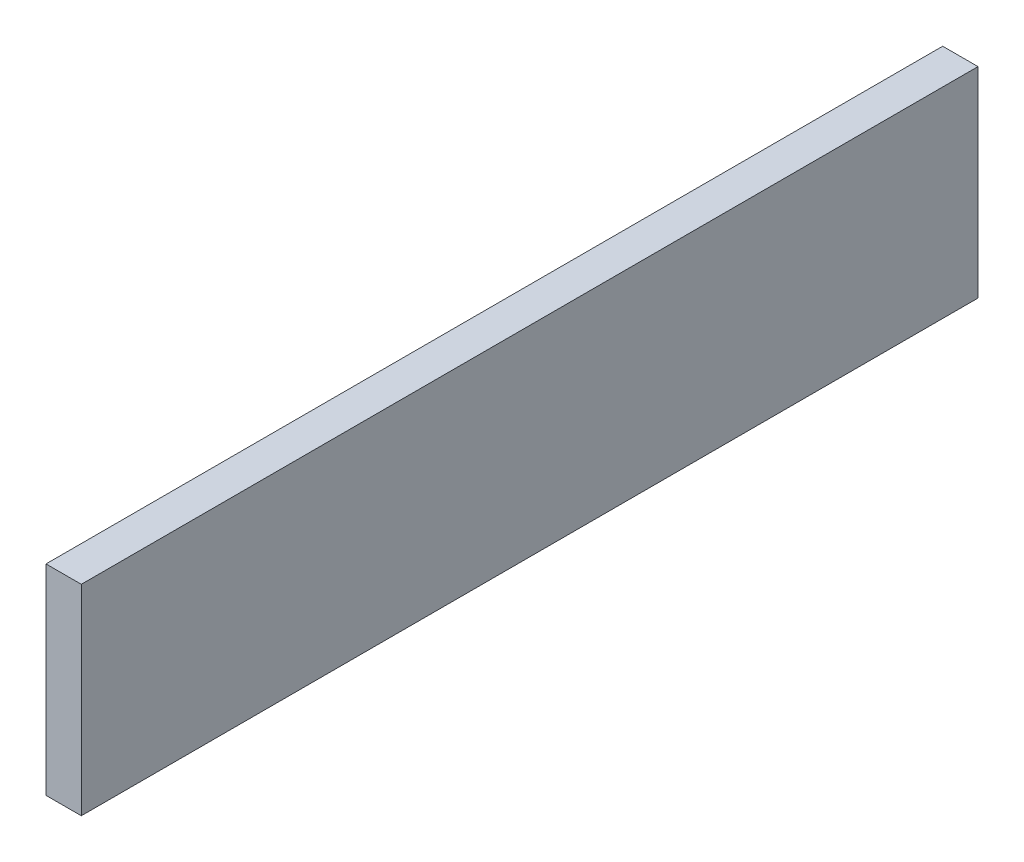
ISO-10303-21;
HEADER;
FILE_DESCRIPTION(('STEP AP214'),'2;1');
FILE_NAME('part.step','',(''),(''),'','','');
FILE_SCHEMA(('AUTOMOTIVE_DESIGN { 1 0 10303 214 1 1 1 1 }'));
ENDSEC;
DATA;
#1=APPLICATION_CONTEXT('core data for automotive mechanical design processes');
#2=APPLICATION_PROTOCOL_DEFINITION('international standard','automotive_design',2000,#1);
#3=PRODUCT_CONTEXT('',#1,'mechanical');
#4=PRODUCT('Part','Part','',(#3));
#5=PRODUCT_RELATED_PRODUCT_CATEGORY('part','',(#4));
#6=PRODUCT_DEFINITION_FORMATION('','',#4);
#7=PRODUCT_DEFINITION_CONTEXT('part definition',#1,'design');
#8=PRODUCT_DEFINITION('design','',#6,#7);
#9=PRODUCT_DEFINITION_SHAPE('','',#8);
#10=(LENGTH_UNIT() NAMED_UNIT(*) SI_UNIT(.MILLI.,.METRE.));
#11=(NAMED_UNIT(*) PLANE_ANGLE_UNIT() SI_UNIT($,.RADIAN.));
#12=(NAMED_UNIT(*) SI_UNIT($,.STERADIAN.) SOLID_ANGLE_UNIT());
#13=UNCERTAINTY_MEASURE_WITH_UNIT(LENGTH_MEASURE(1.E-05),#10,'distance_accuracy_value','');
#14=(GEOMETRIC_REPRESENTATION_CONTEXT(3) GLOBAL_UNCERTAINTY_ASSIGNED_CONTEXT((#13)) GLOBAL_UNIT_ASSIGNED_CONTEXT((#10,
#11,#12)) REPRESENTATION_CONTEXT('',''));
#15=CARTESIAN_POINT('',(0.,0.,0.));
#16=DIRECTION('',(0.,0.,1.));
#17=DIRECTION('',(1.,0.,0.));
#18=AXIS2_PLACEMENT_3D('',#15,#16,#17);
#19=CARTESIAN_POINT('',(57.8859814028704,-22.9233020012127,254.));
#20=DIRECTION('',(0.,0.,1.));
#21=DIRECTION('',(0.,1.,0.));
#22=AXIS2_PLACEMENT_3D('',#19,#20,#21);
#23=PLANE('',#22);
#24=DIRECTION('',(1.,0.,0.));
#25=VECTOR('',#24,1.);
#26=CARTESIAN_POINT('',(57.8859814028704,33.8661128330678,254.));
#27=LINE('',#26,#25);
#28=CARTESIAN_POINT('',(47.8859814028704,33.8661128330678,254.));
#29=VERTEX_POINT('',#28);
#30=CARTESIAN_POINT('',(57.8859814028704,33.8661128330678,254.));
#31=VERTEX_POINT('',#30);
#32=EDGE_CURVE('E11',#29,#31,#27,.T.);
#33=ORIENTED_EDGE('',*,*,#32,.F.);
#34=DIRECTION('',(0.,1.,0.));
#35=VECTOR('',#34,1.);
#36=CARTESIAN_POINT('',(47.8859814028704,-22.9233020012127,254.));
#37=LINE('',#36,#35);
#38=CARTESIAN_POINT('',(47.8859814028704,-22.9233020012127,254.));
#39=VERTEX_POINT('',#38);
#40=EDGE_CURVE('E101',#39,#29,#37,.T.);
#41=ORIENTED_EDGE('',*,*,#40,.F.);
#42=DIRECTION('',(1.,0.,0.));
#43=VECTOR('',#42,1.);
#44=CARTESIAN_POINT('',(57.8859814028704,-22.9233020012127,254.));
#45=LINE('',#44,#43);
#46=CARTESIAN_POINT('',(57.8859814028704,-22.9233020012127,254.));
#47=VERTEX_POINT('',#46);
#48=EDGE_CURVE('E57',#39,#47,#45,.T.);
#49=ORIENTED_EDGE('',*,*,#48,.T.);
#50=DIRECTION('',(0.,1.,0.));
#51=VECTOR('',#50,1.);
#52=CARTESIAN_POINT('',(57.8859814028704,-22.9233020012127,254.));
#53=LINE('',#52,#51);
#54=EDGE_CURVE('E114',#47,#31,#53,.T.);
#55=ORIENTED_EDGE('',*,*,#54,.T.);
#56=EDGE_LOOP('',(#33,#41,#49,#55));
#57=FACE_BOUND('',#56,.T.);
#58=ADVANCED_FACE('F47',(#57),#23,.T.);
#59=CARTESIAN_POINT('',(57.8859814028704,-22.9233020012127,254.));
#60=DIRECTION('',(0.,1.,0.));
#61=DIRECTION('',(0.,0.,-1.));
#62=AXIS2_PLACEMENT_3D('',#59,#60,#61);
#63=PLANE('',#62);
#64=ORIENTED_EDGE('',*,*,#48,.F.);
#65=DIRECTION('',(0.,0.,1.));
#66=VECTOR('',#65,1.);
#67=CARTESIAN_POINT('',(47.8859814028704,-22.9233020012127,254.));
#68=LINE('',#67,#66);
#69=CARTESIAN_POINT('',(47.8859814028704,-22.9233020012127,0.));
#70=VERTEX_POINT('',#69);
#71=EDGE_CURVE('E108',#39,#70,#68,.F.);
#72=ORIENTED_EDGE('',*,*,#71,.T.);
#73=DIRECTION('',(1.,0.,0.));
#74=VECTOR('',#73,1.);
#75=CARTESIAN_POINT('',(57.8859814028704,-22.9233020012127,0.));
#76=LINE('',#75,#74);
#77=CARTESIAN_POINT('',(57.8859814028704,-22.9233020012127,0.));
#78=VERTEX_POINT('',#77);
#79=EDGE_CURVE('E65',#70,#78,#76,.T.);
#80=ORIENTED_EDGE('',*,*,#79,.T.);
#81=DIRECTION('',(0.,0.,-1.));
#82=VECTOR('',#81,1.);
#83=CARTESIAN_POINT('',(57.8859814028704,-22.9233020012127,254.));
#84=LINE('',#83,#82);
#85=EDGE_CURVE('E95',#47,#78,#84,.T.);
#86=ORIENTED_EDGE('',*,*,#85,.F.);
#87=EDGE_LOOP('',(#64,#72,#80,#86));
#88=FACE_BOUND('',#87,.T.);
#89=ADVANCED_FACE('F118',(#88),#63,.F.);
#90=CARTESIAN_POINT('',(57.8859814028704,-22.9233020012127,0.));
#91=DIRECTION('',(0.,0.,1.));
#92=DIRECTION('',(0.,1.,0.));
#93=AXIS2_PLACEMENT_3D('',#90,#91,#92);
#94=PLANE('',#93);
#95=ORIENTED_EDGE('',*,*,#79,.F.);
#96=DIRECTION('',(0.,1.,0.));
#97=VECTOR('',#96,1.);
#98=CARTESIAN_POINT('',(47.8859814028704,-22.9233020012127,0.));
#99=LINE('',#98,#97);
#100=CARTESIAN_POINT('',(47.8859814028704,33.8661128330678,0.));
#101=VERTEX_POINT('',#100);
#102=EDGE_CURVE('E100',#70,#101,#99,.T.);
#103=ORIENTED_EDGE('',*,*,#102,.T.);
#104=DIRECTION('',(1.,0.,0.));
#105=VECTOR('',#104,1.);
#106=CARTESIAN_POINT('',(57.8859814028704,33.8661128330678,0.));
#107=LINE('',#106,#105);
#108=CARTESIAN_POINT('',(57.8859814028704,33.8661128330678,0.));
#109=VERTEX_POINT('',#108);
#110=EDGE_CURVE('E51',#101,#109,#107,.T.);
#111=ORIENTED_EDGE('',*,*,#110,.T.);
#112=DIRECTION('',(0.,1.,0.));
#113=VECTOR('',#112,1.);
#114=CARTESIAN_POINT('',(57.8859814028704,-22.9233020012127,0.));
#115=LINE('',#114,#113);
#116=EDGE_CURVE('E110',#78,#109,#115,.T.);
#117=ORIENTED_EDGE('',*,*,#116,.F.);
#118=EDGE_LOOP('',(#95,#103,#111,#117));
#119=FACE_BOUND('',#118,.T.);
#120=ADVANCED_FACE('F103',(#119),#94,.F.);
#121=CARTESIAN_POINT('',(57.8859814028704,33.8661128330678,254.));
#122=DIRECTION('',(0.,1.,0.));
#123=DIRECTION('',(0.,0.,-1.));
#124=AXIS2_PLACEMENT_3D('',#121,#122,#123);
#125=PLANE('',#124);
#126=DIRECTION('',(0.,0.,1.));
#127=VECTOR('',#126,1.);
#128=CARTESIAN_POINT('',(47.8859814028704,33.8661128330678,254.));
#129=LINE('',#128,#127);
#130=EDGE_CURVE('E89',#29,#101,#129,.F.);
#131=ORIENTED_EDGE('',*,*,#130,.F.);
#132=ORIENTED_EDGE('',*,*,#32,.T.);
#133=DIRECTION('',(0.,0.,-1.));
#134=VECTOR('',#133,1.);
#135=CARTESIAN_POINT('',(57.8859814028704,33.8661128330678,254.));
#136=LINE('',#135,#134);
#137=EDGE_CURVE('E91',#31,#109,#136,.T.);
#138=ORIENTED_EDGE('',*,*,#137,.T.);
#139=ORIENTED_EDGE('',*,*,#110,.F.);
#140=EDGE_LOOP('',(#131,#132,#138,#139));
#141=FACE_BOUND('',#140,.T.);
#142=ADVANCED_FACE('F49',(#141),#125,.T.);
#143=CARTESIAN_POINT('',(57.8859814028704,-22.9233020012127,254.));
#144=DIRECTION('',(-1.,0.,0.));
#145=DIRECTION('',(0.,0.,1.));
#146=AXIS2_PLACEMENT_3D('',#143,#144,#145);
#147=PLANE('',#146);
#148=ORIENTED_EDGE('',*,*,#116,.T.);
#149=ORIENTED_EDGE('',*,*,#137,.F.);
#150=ORIENTED_EDGE('',*,*,#54,.F.);
#151=ORIENTED_EDGE('',*,*,#85,.T.);
#152=EDGE_LOOP('',(#148,#149,#150,#151));
#153=FACE_BOUND('',#152,.T.);
#154=ADVANCED_FACE('F117',(#153),#147,.F.);
#155=CARTESIAN_POINT('',(47.8859814028704,-22.9233020012127,254.));
#156=DIRECTION('',(-1.,0.,0.));
#157=DIRECTION('',(0.,0.,1.));
#158=AXIS2_PLACEMENT_3D('',#155,#156,#157);
#159=PLANE('',#158);
#160=ORIENTED_EDGE('',*,*,#102,.F.);
#161=ORIENTED_EDGE('',*,*,#71,.F.);
#162=ORIENTED_EDGE('',*,*,#40,.T.);
#163=ORIENTED_EDGE('',*,*,#130,.T.);
#164=EDGE_LOOP('',(#160,#161,#162,#163));
#165=FACE_BOUND('',#164,.T.);
#166=ADVANCED_FACE('F98',(#165),#159,.T.);
#167=CLOSED_SHELL('',(#58,#89,#120,#142,#154,#166));
#168=MANIFOLD_SOLID_BREP('B2',#167);
#169=ADVANCED_BREP_SHAPE_REPRESENTATION('',(#18,#168),#14);
#170=SHAPE_DEFINITION_REPRESENTATION(#9,#169);
ENDSEC;
END-ISO-10303-21;
